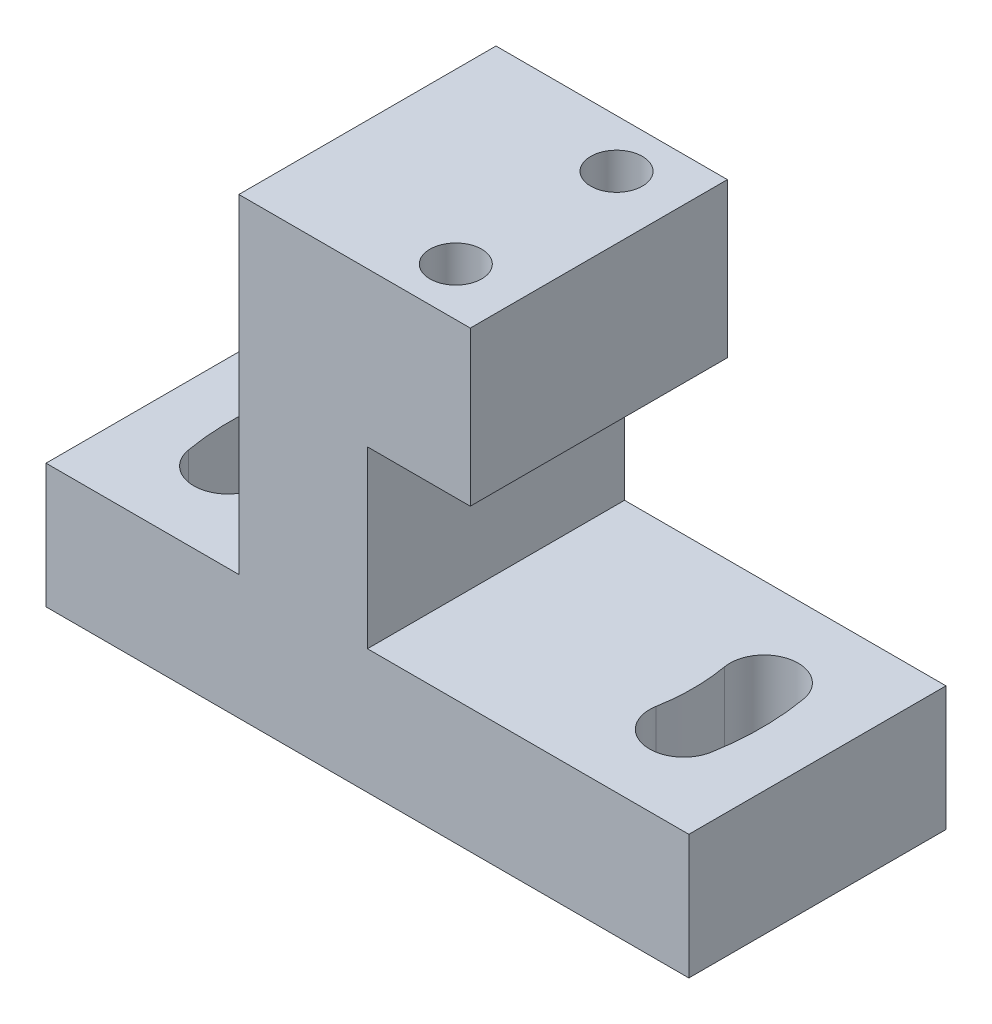
ISO-10303-21;
HEADER;
FILE_DESCRIPTION(('STEP AP214'),'2;1');
FILE_NAME('part.step','',(''),(''),'','','');
FILE_SCHEMA(('AUTOMOTIVE_DESIGN { 1 0 10303 214 1 1 1 1 }'));
ENDSEC;
DATA;
#1=APPLICATION_CONTEXT('core data for automotive mechanical design processes');
#2=APPLICATION_PROTOCOL_DEFINITION('international standard','automotive_design',2000,#1);
#3=PRODUCT_CONTEXT('',#1,'mechanical');
#4=PRODUCT('Part','Part','',(#3));
#5=PRODUCT_RELATED_PRODUCT_CATEGORY('part','',(#4));
#6=PRODUCT_DEFINITION_FORMATION('','',#4);
#7=PRODUCT_DEFINITION_CONTEXT('part definition',#1,'design');
#8=PRODUCT_DEFINITION('design','',#6,#7);
#9=PRODUCT_DEFINITION_SHAPE('','',#8);
#10=(LENGTH_UNIT() NAMED_UNIT(*) SI_UNIT(.MILLI.,.METRE.));
#11=(NAMED_UNIT(*) PLANE_ANGLE_UNIT() SI_UNIT($,.RADIAN.));
#12=(NAMED_UNIT(*) SI_UNIT($,.STERADIAN.) SOLID_ANGLE_UNIT());
#13=UNCERTAINTY_MEASURE_WITH_UNIT(LENGTH_MEASURE(1.E-05),#10,'distance_accuracy_value','');
#14=(GEOMETRIC_REPRESENTATION_CONTEXT(3) GLOBAL_UNCERTAINTY_ASSIGNED_CONTEXT((#13)) GLOBAL_UNIT_ASSIGNED_CONTEXT((#10,
#11,#12)) REPRESENTATION_CONTEXT('',''));
#15=CARTESIAN_POINT('',(0.,0.,0.));
#16=DIRECTION('',(0.,0.,1.));
#17=DIRECTION('',(1.,0.,0.));
#18=AXIS2_PLACEMENT_3D('',#15,#16,#17);
#19=CARTESIAN_POINT('',(-31.75,0.,12.7));
#20=DIRECTION('',(0.,1.,0.));
#21=DIRECTION('',(-1.,0.,0.));
#22=AXIS2_PLACEMENT_3D('',#19,#20,#21);
#23=PLANE('',#22);
#24=DIRECTION('',(1.,0.,0.));
#25=VECTOR('',#24,1.);
#26=CARTESIAN_POINT('',(-31.75,0.,-12.7));
#27=LINE('',#26,#25);
#28=CARTESIAN_POINT('',(-31.75,0.,-12.7));
#29=VERTEX_POINT('',#28);
#30=CARTESIAN_POINT('',(31.75,0.,-12.7));
#31=VERTEX_POINT('',#30);
#32=EDGE_CURVE('E253',#29,#31,#27,.T.);
#33=ORIENTED_EDGE('',*,*,#32,.T.);
#34=DIRECTION('',(0.,0.,-1.));
#35=VECTOR('',#34,1.);
#36=CARTESIAN_POINT('',(31.75,0.,12.7));
#37=LINE('',#36,#35);
#38=CARTESIAN_POINT('',(31.75,0.,12.7));
#39=VERTEX_POINT('',#38);
#40=EDGE_CURVE('E42',#39,#31,#37,.T.);
#41=ORIENTED_EDGE('',*,*,#40,.F.);
#42=DIRECTION('',(1.,0.,0.));
#43=VECTOR('',#42,1.);
#44=CARTESIAN_POINT('',(-31.75,0.,12.7));
#45=LINE('',#44,#43);
#46=CARTESIAN_POINT('',(-31.75,0.,12.7));
#47=VERTEX_POINT('',#46);
#48=EDGE_CURVE('E231',#47,#39,#45,.T.);
#49=ORIENTED_EDGE('',*,*,#48,.F.);
#50=DIRECTION('',(0.,0.,-1.));
#51=VECTOR('',#50,1.);
#52=CARTESIAN_POINT('',(-31.75,0.,12.7));
#53=LINE('',#52,#51);
#54=EDGE_CURVE('E11',#47,#29,#53,.T.);
#55=ORIENTED_EDGE('',*,*,#54,.T.);
#56=EDGE_LOOP('',(#33,#41,#49,#55));
#57=FACE_BOUND('',#56,.T.);
#58=CARTESIAN_POINT('',(22.5127052338591,0.,-3.96959734146596));
#59=DIRECTION('',(0.,1.,0.));
#60=DIRECTION('',(-1.,0.,0.));
#61=AXIS2_PLACEMENT_3D('',#58,#59,#60);
#62=CIRCLE('',#61,3.37820000000001);
#63=CARTESIAN_POINT('',(25.8395827850849,0.,-4.55621561526037));
#64=VERTEX_POINT('',#63);
#65=CARTESIAN_POINT('',(19.1858276826332,0.,-3.38297906767155));
#66=VERTEX_POINT('',#65);
#67=EDGE_CURVE('E206',#64,#66,#62,.T.);
#68=ORIENTED_EDGE('',*,*,#67,.T.);
#69=CARTESIAN_POINT('',(0.,0.,0.));
#70=DIRECTION('',(0.,-1.,0.));
#71=DIRECTION('',(-1.,0.,0.));
#72=AXIS2_PLACEMENT_3D('',#69,#70,#71);
#73=CIRCLE('',#72,19.4818);
#74=CARTESIAN_POINT('',(19.1858276826332,0.,3.38297906767154));
#75=VERTEX_POINT('',#74);
#76=EDGE_CURVE('E196',#66,#75,#73,.T.);
#77=ORIENTED_EDGE('',*,*,#76,.T.);
#78=CARTESIAN_POINT('',(22.5127052338591,0.,3.96959734146595));
#79=DIRECTION('',(0.,1.,0.));
#80=DIRECTION('',(-1.,0.,0.));
#81=AXIS2_PLACEMENT_3D('',#78,#79,#80);
#82=CIRCLE('',#81,3.37820000000001);
#83=CARTESIAN_POINT('',(25.8395827850849,0.,4.55621561526037));
#84=VERTEX_POINT('',#83);
#85=EDGE_CURVE('E199',#75,#84,#82,.T.);
#86=ORIENTED_EDGE('',*,*,#85,.T.);
#87=CARTESIAN_POINT('',(0.,0.,0.));
#88=DIRECTION('',(0.,1.,0.));
#89=DIRECTION('',(-1.,0.,0.));
#90=AXIS2_PLACEMENT_3D('',#87,#88,#89);
#91=CIRCLE('',#90,26.2382000000001);
#92=EDGE_CURVE('E203',#84,#64,#91,.T.);
#93=ORIENTED_EDGE('',*,*,#92,.T.);
#94=EDGE_LOOP('',(#68,#77,#86,#93));
#95=FACE_BOUND('',#94,.T.);
#96=CARTESIAN_POINT('',(0.,0.,0.));
#97=DIRECTION('',(0.,1.,0.));
#98=DIRECTION('',(1.,0.,0.));
#99=AXIS2_PLACEMENT_3D('',#96,#97,#98);
#100=CIRCLE('',#99,19.4818);
#101=CARTESIAN_POINT('',(-19.1858276826332,0.,-3.38297906767155));
#102=VERTEX_POINT('',#101);
#103=CARTESIAN_POINT('',(-19.1858276826332,0.,3.38297906767154));
#104=VERTEX_POINT('',#103);
#105=EDGE_CURVE('E167',#102,#104,#100,.T.);
#106=ORIENTED_EDGE('',*,*,#105,.F.);
#107=CARTESIAN_POINT('',(-22.5127052338591,0.,-3.96959734146596));
#108=DIRECTION('',(0.,-1.,0.));
#109=DIRECTION('',(1.,0.,0.));
#110=AXIS2_PLACEMENT_3D('',#107,#108,#109);
#111=CIRCLE('',#110,3.37820000000001);
#112=CARTESIAN_POINT('',(-25.8395827850849,0.,-4.55621561526037));
#113=VERTEX_POINT('',#112);
#114=EDGE_CURVE('E159',#113,#102,#111,.T.);
#115=ORIENTED_EDGE('',*,*,#114,.F.);
#116=CARTESIAN_POINT('',(0.,0.,0.));
#117=DIRECTION('',(0.,-1.,0.));
#118=DIRECTION('',(1.,0.,0.));
#119=AXIS2_PLACEMENT_3D('',#116,#117,#118);
#120=CIRCLE('',#119,26.2382000000001);
#121=CARTESIAN_POINT('',(-25.839582785085,0.,4.55621561526038));
#122=VERTEX_POINT('',#121);
#123=EDGE_CURVE('E166',#122,#113,#120,.T.);
#124=ORIENTED_EDGE('',*,*,#123,.F.);
#125=CARTESIAN_POINT('',(-22.5127052338591,0.,3.96959734146595));
#126=DIRECTION('',(0.,-1.,0.));
#127=DIRECTION('',(1.,0.,0.));
#128=AXIS2_PLACEMENT_3D('',#125,#126,#127);
#129=CIRCLE('',#128,3.37820000000001);
#130=EDGE_CURVE('E171',#104,#122,#129,.T.);
#131=ORIENTED_EDGE('',*,*,#130,.F.);
#132=EDGE_LOOP('',(#106,#115,#124,#131));
#133=FACE_BOUND('',#132,.T.);
#134=ADVANCED_FACE('F34',(#57,#95,#133),#23,.F.);
#135=CARTESIAN_POINT('',(-31.75,12.2936,12.7));
#136=DIRECTION('',(0.,-1.,0.));
#137=DIRECTION('',(0.,0.,-1.));
#138=AXIS2_PLACEMENT_3D('',#135,#136,#137);
#139=PLANE('',#138);
#140=DIRECTION('',(-1.,0.,0.));
#141=VECTOR('',#140,1.);
#142=CARTESIAN_POINT('',(-31.75,12.2936,-12.7));
#143=LINE('',#142,#141);
#144=CARTESIAN_POINT('',(-12.7,12.2936,-12.7));
#145=VERTEX_POINT('',#144);
#146=CARTESIAN_POINT('',(-31.75,12.2936,-12.7));
#147=VERTEX_POINT('',#146);
#148=EDGE_CURVE('E232',#145,#147,#143,.T.);
#149=ORIENTED_EDGE('',*,*,#148,.T.);
#150=DIRECTION('',(0.,0.,-1.));
#151=VECTOR('',#150,1.);
#152=CARTESIAN_POINT('',(-31.75,12.2936,12.7));
#153=LINE('',#152,#151);
#154=CARTESIAN_POINT('',(-31.75,12.2936,12.7));
#155=VERTEX_POINT('',#154);
#156=EDGE_CURVE('E250',#155,#147,#153,.T.);
#157=ORIENTED_EDGE('',*,*,#156,.F.);
#158=DIRECTION('',(-1.,0.,0.));
#159=VECTOR('',#158,1.);
#160=CARTESIAN_POINT('',(-31.75,12.2936,12.7));
#161=LINE('',#160,#159);
#162=CARTESIAN_POINT('',(-12.7,12.2936,12.7));
#163=VERTEX_POINT('',#162);
#164=EDGE_CURVE('E248',#163,#155,#161,.T.);
#165=ORIENTED_EDGE('',*,*,#164,.F.);
#166=DIRECTION('',(0.,0.,-1.));
#167=VECTOR('',#166,1.);
#168=CARTESIAN_POINT('',(-12.7,12.2936,12.7));
#169=LINE('',#168,#167);
#170=EDGE_CURVE('E273',#163,#145,#169,.T.);
#171=ORIENTED_EDGE('',*,*,#170,.T.);
#172=EDGE_LOOP('',(#149,#157,#165,#171));
#173=FACE_BOUND('',#172,.T.);
#174=CARTESIAN_POINT('',(0.,12.2936,0.));
#175=DIRECTION('',(0.,1.,0.));
#176=DIRECTION('',(1.,0.,0.));
#177=AXIS2_PLACEMENT_3D('',#174,#175,#176);
#178=CIRCLE('',#177,19.4818);
#179=CARTESIAN_POINT('',(-19.1858276826332,12.2936,-3.38297906767155));
#180=VERTEX_POINT('',#179);
#181=CARTESIAN_POINT('',(-19.1858276826332,12.2936,3.38297906767154));
#182=VERTEX_POINT('',#181);
#183=EDGE_CURVE('E57',#180,#182,#178,.T.);
#184=ORIENTED_EDGE('',*,*,#183,.T.);
#185=CARTESIAN_POINT('',(-22.5127052338591,12.2936,3.96959734146595));
#186=DIRECTION('',(0.,-1.,0.));
#187=DIRECTION('',(1.,0.,0.));
#188=AXIS2_PLACEMENT_3D('',#185,#186,#187);
#189=CIRCLE('',#188,3.37820000000001);
#190=CARTESIAN_POINT('',(-25.839582785085,12.2936,4.55621561526038));
#191=VERTEX_POINT('',#190);
#192=EDGE_CURVE('E174',#182,#191,#189,.T.);
#193=ORIENTED_EDGE('',*,*,#192,.T.);
#194=CARTESIAN_POINT('',(0.,12.2936,0.));
#195=DIRECTION('',(0.,-1.,0.));
#196=DIRECTION('',(1.,0.,0.));
#197=AXIS2_PLACEMENT_3D('',#194,#195,#196);
#198=CIRCLE('',#197,26.2382000000001);
#199=CARTESIAN_POINT('',(-25.8395827850849,12.2936,-4.55621561526037));
#200=VERTEX_POINT('',#199);
#201=EDGE_CURVE('E177',#191,#200,#198,.T.);
#202=ORIENTED_EDGE('',*,*,#201,.T.);
#203=CARTESIAN_POINT('',(-22.5127052338591,12.2936,-3.96959734146596));
#204=DIRECTION('',(0.,-1.,0.));
#205=DIRECTION('',(1.,0.,0.));
#206=AXIS2_PLACEMENT_3D('',#203,#204,#205);
#207=CIRCLE('',#206,3.37820000000001);
#208=EDGE_CURVE('E186',#200,#180,#207,.T.);
#209=ORIENTED_EDGE('',*,*,#208,.T.);
#210=EDGE_LOOP('',(#184,#193,#202,#209));
#211=FACE_BOUND('',#210,.T.);
#212=ADVANCED_FACE('F327',(#173,#211),#139,.F.);
#213=CARTESIAN_POINT('',(-31.75,0.,12.7));
#214=DIRECTION('',(1.,0.,0.));
#215=DIRECTION('',(0.,0.,-1.));
#216=AXIS2_PLACEMENT_3D('',#213,#214,#215);
#217=PLANE('',#216);
#218=DIRECTION('',(0.,-1.,0.));
#219=VECTOR('',#218,1.);
#220=CARTESIAN_POINT('',(-31.75,0.,-12.7));
#221=LINE('',#220,#219);
#222=EDGE_CURVE('E221',#147,#29,#221,.T.);
#223=ORIENTED_EDGE('',*,*,#222,.T.);
#224=ORIENTED_EDGE('',*,*,#54,.F.);
#225=DIRECTION('',(0.,-1.,0.));
#226=VECTOR('',#225,1.);
#227=CARTESIAN_POINT('',(-31.75,0.,12.7));
#228=LINE('',#227,#226);
#229=EDGE_CURVE('E228',#155,#47,#228,.T.);
#230=ORIENTED_EDGE('',*,*,#229,.F.);
#231=ORIENTED_EDGE('',*,*,#156,.T.);
#232=EDGE_LOOP('',(#223,#224,#230,#231));
#233=FACE_BOUND('',#232,.T.);
#234=ADVANCED_FACE('F36',(#233),#217,.F.);
#235=CARTESIAN_POINT('',(31.75,0.,12.7));
#236=DIRECTION('',(-1.,0.,0.));
#237=DIRECTION('',(0.,-1.,0.));
#238=AXIS2_PLACEMENT_3D('',#235,#236,#237);
#239=PLANE('',#238);
#240=DIRECTION('',(0.,1.,0.));
#241=VECTOR('',#240,1.);
#242=CARTESIAN_POINT('',(31.75,0.,-12.7));
#243=LINE('',#242,#241);
#244=CARTESIAN_POINT('',(31.75,12.2936,-12.7));
#245=VERTEX_POINT('',#244);
#246=EDGE_CURVE('E255',#31,#245,#243,.T.);
#247=ORIENTED_EDGE('',*,*,#246,.T.);
#248=DIRECTION('',(0.,0.,-1.));
#249=VECTOR('',#248,1.);
#250=CARTESIAN_POINT('',(31.75,12.2936,12.7));
#251=LINE('',#250,#249);
#252=CARTESIAN_POINT('',(31.75,12.2936,12.7));
#253=VERTEX_POINT('',#252);
#254=EDGE_CURVE('E291',#253,#245,#251,.T.);
#255=ORIENTED_EDGE('',*,*,#254,.F.);
#256=DIRECTION('',(0.,1.,0.));
#257=VECTOR('',#256,1.);
#258=CARTESIAN_POINT('',(31.75,0.,12.7));
#259=LINE('',#258,#257);
#260=EDGE_CURVE('E234',#39,#253,#259,.T.);
#261=ORIENTED_EDGE('',*,*,#260,.F.);
#262=ORIENTED_EDGE('',*,*,#40,.T.);
#263=EDGE_LOOP('',(#247,#255,#261,#262));
#264=FACE_BOUND('',#263,.T.);
#265=ADVANCED_FACE('F298',(#264),#239,.F.);
#266=CARTESIAN_POINT('',(12.7,12.2936,12.7));
#267=DIRECTION('',(0.,-1.,0.));
#268=DIRECTION('',(1.,0.,0.));
#269=AXIS2_PLACEMENT_3D('',#266,#267,#268);
#270=PLANE('',#269);
#271=CARTESIAN_POINT('',(22.5127052338591,12.2936,3.96959734146595));
#272=DIRECTION('',(0.,1.,0.));
#273=DIRECTION('',(-1.,0.,0.));
#274=AXIS2_PLACEMENT_3D('',#271,#272,#273);
#275=CIRCLE('',#274,3.37820000000001);
#276=CARTESIAN_POINT('',(19.1858276826332,12.2936,3.38297906767154));
#277=VERTEX_POINT('',#276);
#278=CARTESIAN_POINT('',(25.839582785085,12.2936,4.55621561526038));
#279=VERTEX_POINT('',#278);
#280=EDGE_CURVE('E211',#277,#279,#275,.T.);
#281=ORIENTED_EDGE('',*,*,#280,.F.);
#282=CARTESIAN_POINT('',(0.,12.2936,0.));
#283=DIRECTION('',(0.,-1.,0.));
#284=DIRECTION('',(-1.,0.,0.));
#285=AXIS2_PLACEMENT_3D('',#282,#283,#284);
#286=CIRCLE('',#285,19.4818);
#287=CARTESIAN_POINT('',(19.1858276826332,12.2936,-3.38297906767155));
#288=VERTEX_POINT('',#287);
#289=EDGE_CURVE('E192',#288,#277,#286,.T.);
#290=ORIENTED_EDGE('',*,*,#289,.F.);
#291=CARTESIAN_POINT('',(22.5127052338591,12.2936,-3.96959734146596));
#292=DIRECTION('',(0.,1.,0.));
#293=DIRECTION('',(-1.,0.,0.));
#294=AXIS2_PLACEMENT_3D('',#291,#292,#293);
#295=CIRCLE('',#294,3.37820000000001);
#296=CARTESIAN_POINT('',(25.8395827850849,12.2936,-4.55621561526037));
#297=VERTEX_POINT('',#296);
#298=EDGE_CURVE('E200',#297,#288,#295,.T.);
#299=ORIENTED_EDGE('',*,*,#298,.F.);
#300=CARTESIAN_POINT('',(0.,12.2936,0.));
#301=DIRECTION('',(0.,1.,0.));
#302=DIRECTION('',(-1.,0.,0.));
#303=AXIS2_PLACEMENT_3D('',#300,#301,#302);
#304=CIRCLE('',#303,26.2382000000001);
#305=EDGE_CURVE('E214',#279,#297,#304,.T.);
#306=ORIENTED_EDGE('',*,*,#305,.F.);
#307=EDGE_LOOP('',(#281,#290,#299,#306));
#308=FACE_BOUND('',#307,.T.);
#309=DIRECTION('',(-1.,0.,0.));
#310=VECTOR('',#309,1.);
#311=CARTESIAN_POINT('',(12.7,12.2936,-12.7));
#312=LINE('',#311,#310);
#313=CARTESIAN_POINT('',(0.,12.2936,-12.7));
#314=VERTEX_POINT('',#313);
#315=EDGE_CURVE('E258',#245,#314,#312,.T.);
#316=ORIENTED_EDGE('',*,*,#315,.T.);
#317=DIRECTION('',(0.,0.,-1.));
#318=VECTOR('',#317,1.);
#319=CARTESIAN_POINT('',(0.,12.2936,12.7));
#320=LINE('',#319,#318);
#321=CARTESIAN_POINT('',(0.,12.2936,12.7));
#322=VERTEX_POINT('',#321);
#323=EDGE_CURVE('E288',#322,#314,#320,.T.);
#324=ORIENTED_EDGE('',*,*,#323,.F.);
#325=DIRECTION('',(-1.,0.,0.));
#326=VECTOR('',#325,1.);
#327=CARTESIAN_POINT('',(12.7,12.2936,12.7));
#328=LINE('',#327,#326);
#329=EDGE_CURVE('E236',#253,#322,#328,.T.);
#330=ORIENTED_EDGE('',*,*,#329,.F.);
#331=ORIENTED_EDGE('',*,*,#254,.T.);
#332=EDGE_LOOP('',(#316,#324,#330,#331));
#333=FACE_BOUND('',#332,.T.);
#334=ADVANCED_FACE('F308',(#308,#333),#270,.F.);
#335=CARTESIAN_POINT('',(0.,29.5656,12.7));
#336=DIRECTION('',(-1.,0.,0.));
#337=DIRECTION('',(0.,-1.,0.));
#338=AXIS2_PLACEMENT_3D('',#335,#336,#337);
#339=PLANE('',#338);
#340=DIRECTION('',(0.,1.,0.));
#341=VECTOR('',#340,1.);
#342=CARTESIAN_POINT('',(0.,29.5656,-12.7));
#343=LINE('',#342,#341);
#344=CARTESIAN_POINT('',(0.,29.5656,-12.7));
#345=VERTEX_POINT('',#344);
#346=EDGE_CURVE('E260',#314,#345,#343,.T.);
#347=ORIENTED_EDGE('',*,*,#346,.T.);
#348=DIRECTION('',(0.,0.,-1.));
#349=VECTOR('',#348,1.);
#350=CARTESIAN_POINT('',(0.,29.5656,12.7));
#351=LINE('',#350,#349);
#352=CARTESIAN_POINT('',(0.,29.5656,12.7));
#353=VERTEX_POINT('',#352);
#354=EDGE_CURVE('E285',#353,#345,#351,.T.);
#355=ORIENTED_EDGE('',*,*,#354,.F.);
#356=DIRECTION('',(0.,1.,0.));
#357=VECTOR('',#356,1.);
#358=CARTESIAN_POINT('',(0.,29.5656,12.7));
#359=LINE('',#358,#357);
#360=EDGE_CURVE('E238',#322,#353,#359,.T.);
#361=ORIENTED_EDGE('',*,*,#360,.F.);
#362=ORIENTED_EDGE('',*,*,#323,.T.);
#363=EDGE_LOOP('',(#347,#355,#361,#362));
#364=FACE_BOUND('',#363,.T.);
#365=ADVANCED_FACE('F312',(#364),#339,.F.);
#366=CARTESIAN_POINT('',(10.16,29.5656,12.7));
#367=DIRECTION('',(0.,1.,0.));
#368=DIRECTION('',(0.,0.,1.));
#369=AXIS2_PLACEMENT_3D('',#366,#367,#368);
#370=PLANE('',#369);
#371=CARTESIAN_POINT('',(3.96875,29.5656,-7.9375));
#372=DIRECTION('',(0.,1.,0.));
#373=DIRECTION('',(0.,0.,1.));
#374=AXIS2_PLACEMENT_3D('',#371,#372,#373);
#375=CIRCLE('',#374,2.5527);
#376=CARTESIAN_POINT('',(3.96875,29.5656,-5.3848));
#377=VERTEX_POINT('',#376);
#378=EDGE_CURVE('E414',#377,#377,#375,.F.);
#379=ORIENTED_EDGE('',*,*,#378,.F.);
#380=EDGE_LOOP('',(#379));
#381=FACE_BOUND('',#380,.T.);
#382=CARTESIAN_POINT('',(3.96875,29.5656,7.9375));
#383=DIRECTION('',(0.,1.,0.));
#384=DIRECTION('',(0.,0.,1.));
#385=AXIS2_PLACEMENT_3D('',#382,#383,#384);
#386=CIRCLE('',#385,2.5527);
#387=CARTESIAN_POINT('',(3.96875,29.5656,10.4902));
#388=VERTEX_POINT('',#387);
#389=EDGE_CURVE('E180',#388,#388,#386,.F.);
#390=ORIENTED_EDGE('',*,*,#389,.F.);
#391=EDGE_LOOP('',(#390));
#392=FACE_BOUND('',#391,.T.);
#393=DIRECTION('',(1.,0.,0.));
#394=VECTOR('',#393,1.);
#395=CARTESIAN_POINT('',(10.16,29.5656,-12.7));
#396=LINE('',#395,#394);
#397=CARTESIAN_POINT('',(10.16,29.5656,-12.7));
#398=VERTEX_POINT('',#397);
#399=EDGE_CURVE('E262',#345,#398,#396,.T.);
#400=ORIENTED_EDGE('',*,*,#399,.T.);
#401=DIRECTION('',(0.,0.,-1.));
#402=VECTOR('',#401,1.);
#403=CARTESIAN_POINT('',(10.16,29.5656,12.7));
#404=LINE('',#403,#402);
#405=CARTESIAN_POINT('',(10.16,29.5656,12.7));
#406=VERTEX_POINT('',#405);
#407=EDGE_CURVE('E282',#406,#398,#404,.T.);
#408=ORIENTED_EDGE('',*,*,#407,.F.);
#409=DIRECTION('',(1.,0.,0.));
#410=VECTOR('',#409,1.);
#411=CARTESIAN_POINT('',(10.16,29.5656,12.7));
#412=LINE('',#411,#410);
#413=EDGE_CURVE('E240',#353,#406,#412,.T.);
#414=ORIENTED_EDGE('',*,*,#413,.F.);
#415=ORIENTED_EDGE('',*,*,#354,.T.);
#416=EDGE_LOOP('',(#400,#408,#414,#415));
#417=FACE_BOUND('',#416,.T.);
#418=ADVANCED_FACE('F344',(#381,#392,#417),#370,.F.);
#419=CARTESIAN_POINT('',(10.16,44.8056,12.7));
#420=DIRECTION('',(-1.,0.,0.));
#421=DIRECTION('',(0.,0.,1.));
#422=AXIS2_PLACEMENT_3D('',#419,#420,#421);
#423=PLANE('',#422);
#424=DIRECTION('',(0.,1.,0.));
#425=VECTOR('',#424,1.);
#426=CARTESIAN_POINT('',(10.16,44.8056,-12.7));
#427=LINE('',#426,#425);
#428=CARTESIAN_POINT('',(10.16,44.8056,-12.7));
#429=VERTEX_POINT('',#428);
#430=EDGE_CURVE('E264',#398,#429,#427,.T.);
#431=ORIENTED_EDGE('',*,*,#430,.T.);
#432=DIRECTION('',(0.,0.,-1.));
#433=VECTOR('',#432,1.);
#434=CARTESIAN_POINT('',(10.16,44.8056,12.7));
#435=LINE('',#434,#433);
#436=CARTESIAN_POINT('',(10.16,44.8056,12.7));
#437=VERTEX_POINT('',#436);
#438=EDGE_CURVE('E279',#437,#429,#435,.T.);
#439=ORIENTED_EDGE('',*,*,#438,.F.);
#440=DIRECTION('',(0.,1.,0.));
#441=VECTOR('',#440,1.);
#442=CARTESIAN_POINT('',(10.16,44.8056,12.7));
#443=LINE('',#442,#441);
#444=EDGE_CURVE('E242',#406,#437,#443,.T.);
#445=ORIENTED_EDGE('',*,*,#444,.F.);
#446=ORIENTED_EDGE('',*,*,#407,.T.);
#447=EDGE_LOOP('',(#431,#439,#445,#446));
#448=FACE_BOUND('',#447,.T.);
#449=ADVANCED_FACE('F341',(#448),#423,.F.);
#450=CARTESIAN_POINT('',(-12.7,44.8056,12.7));
#451=DIRECTION('',(0.,-1.,0.));
#452=DIRECTION('',(0.,0.,-1.));
#453=AXIS2_PLACEMENT_3D('',#450,#451,#452);
#454=PLANE('',#453);
#455=CARTESIAN_POINT('',(3.96875,44.8056,-7.9375));
#456=DIRECTION('',(0.,1.,0.));
#457=DIRECTION('',(0.,0.,1.));
#458=AXIS2_PLACEMENT_3D('',#455,#456,#457);
#459=CIRCLE('',#458,2.5527);
#460=CARTESIAN_POINT('',(3.96875,44.8056,-5.3848));
#461=VERTEX_POINT('',#460);
#462=EDGE_CURVE('E409',#461,#461,#459,.T.);
#463=ORIENTED_EDGE('',*,*,#462,.F.);
#464=EDGE_LOOP('',(#463));
#465=FACE_BOUND('',#464,.T.);
#466=CARTESIAN_POINT('',(3.96875,44.8056,7.9375));
#467=DIRECTION('',(0.,1.,0.));
#468=DIRECTION('',(0.,0.,1.));
#469=AXIS2_PLACEMENT_3D('',#466,#467,#468);
#470=CIRCLE('',#469,2.5527);
#471=CARTESIAN_POINT('',(3.96875,44.8056,10.4902));
#472=VERTEX_POINT('',#471);
#473=EDGE_CURVE('E412',#472,#472,#470,.T.);
#474=ORIENTED_EDGE('',*,*,#473,.F.);
#475=EDGE_LOOP('',(#474));
#476=FACE_BOUND('',#475,.T.);
#477=DIRECTION('',(-1.,0.,0.));
#478=VECTOR('',#477,1.);
#479=CARTESIAN_POINT('',(-12.7,44.8056,-12.7));
#480=LINE('',#479,#478);
#481=CARTESIAN_POINT('',(-12.7,44.8056,-12.7));
#482=VERTEX_POINT('',#481);
#483=EDGE_CURVE('E266',#429,#482,#480,.T.);
#484=ORIENTED_EDGE('',*,*,#483,.T.);
#485=DIRECTION('',(0.,0.,-1.));
#486=VECTOR('',#485,1.);
#487=CARTESIAN_POINT('',(-12.7,44.8056,12.7));
#488=LINE('',#487,#486);
#489=CARTESIAN_POINT('',(-12.7,44.8056,12.7));
#490=VERTEX_POINT('',#489);
#491=EDGE_CURVE('E276',#490,#482,#488,.T.);
#492=ORIENTED_EDGE('',*,*,#491,.F.);
#493=DIRECTION('',(-1.,0.,0.));
#494=VECTOR('',#493,1.);
#495=CARTESIAN_POINT('',(-12.7,44.8056,12.7));
#496=LINE('',#495,#494);
#497=EDGE_CURVE('E244',#437,#490,#496,.T.);
#498=ORIENTED_EDGE('',*,*,#497,.F.);
#499=ORIENTED_EDGE('',*,*,#438,.T.);
#500=EDGE_LOOP('',(#484,#492,#498,#499));
#501=FACE_BOUND('',#500,.T.);
#502=ADVANCED_FACE('F337',(#465,#476,#501),#454,.F.);
#503=CARTESIAN_POINT('',(-12.7,12.2936,12.7));
#504=DIRECTION('',(1.,0.,0.));
#505=DIRECTION('',(0.,1.,0.));
#506=AXIS2_PLACEMENT_3D('',#503,#504,#505);
#507=PLANE('',#506);
#508=DIRECTION('',(0.,-1.,0.));
#509=VECTOR('',#508,1.);
#510=CARTESIAN_POINT('',(-12.7,12.2936,-12.7));
#511=LINE('',#510,#509);
#512=EDGE_CURVE('E268',#482,#145,#511,.T.);
#513=ORIENTED_EDGE('',*,*,#512,.T.);
#514=ORIENTED_EDGE('',*,*,#170,.F.);
#515=DIRECTION('',(0.,-1.,0.));
#516=VECTOR('',#515,1.);
#517=CARTESIAN_POINT('',(-12.7,12.2936,12.7));
#518=LINE('',#517,#516);
#519=EDGE_CURVE('E246',#490,#163,#518,.T.);
#520=ORIENTED_EDGE('',*,*,#519,.F.);
#521=ORIENTED_EDGE('',*,*,#491,.T.);
#522=EDGE_LOOP('',(#513,#514,#520,#521));
#523=FACE_BOUND('',#522,.T.);
#524=ADVANCED_FACE('F333',(#523),#507,.F.);
#525=CARTESIAN_POINT('',(-31.75,12.2936,12.7));
#526=DIRECTION('',(0.,0.,-1.));
#527=DIRECTION('',(-1.,0.,0.));
#528=AXIS2_PLACEMENT_3D('',#525,#526,#527);
#529=PLANE('',#528);
#530=ORIENTED_EDGE('',*,*,#229,.T.);
#531=ORIENTED_EDGE('',*,*,#48,.T.);
#532=ORIENTED_EDGE('',*,*,#260,.T.);
#533=ORIENTED_EDGE('',*,*,#329,.T.);
#534=ORIENTED_EDGE('',*,*,#360,.T.);
#535=ORIENTED_EDGE('',*,*,#413,.T.);
#536=ORIENTED_EDGE('',*,*,#444,.T.);
#537=ORIENTED_EDGE('',*,*,#497,.T.);
#538=ORIENTED_EDGE('',*,*,#519,.T.);
#539=ORIENTED_EDGE('',*,*,#164,.T.);
#540=EDGE_LOOP('',(#530,#531,#532,#533,#534,#535,#536,#537,#538,#539));
#541=FACE_BOUND('',#540,.T.);
#542=ADVANCED_FACE('F316',(#541),#529,.F.);
#543=CARTESIAN_POINT('',(-31.75,12.2936,-12.7));
#544=DIRECTION('',(0.,0.,-1.));
#545=DIRECTION('',(-1.,0.,0.));
#546=AXIS2_PLACEMENT_3D('',#543,#544,#545);
#547=PLANE('',#546);
#548=ORIENTED_EDGE('',*,*,#222,.F.);
#549=ORIENTED_EDGE('',*,*,#148,.F.);
#550=ORIENTED_EDGE('',*,*,#512,.F.);
#551=ORIENTED_EDGE('',*,*,#483,.F.);
#552=ORIENTED_EDGE('',*,*,#430,.F.);
#553=ORIENTED_EDGE('',*,*,#399,.F.);
#554=ORIENTED_EDGE('',*,*,#346,.F.);
#555=ORIENTED_EDGE('',*,*,#315,.F.);
#556=ORIENTED_EDGE('',*,*,#246,.F.);
#557=ORIENTED_EDGE('',*,*,#32,.F.);
#558=EDGE_LOOP('',(#548,#549,#550,#551,#552,#553,#554,#555,#556,#557));
#559=FACE_BOUND('',#558,.T.);
#560=ADVANCED_FACE('F303',(#559),#547,.T.);
#561=CARTESIAN_POINT('',(0.,0.,0.));
#562=DIRECTION('',(0.,1.,0.));
#563=DIRECTION('',(-1.,0.,0.));
#564=AXIS2_PLACEMENT_3D('',#561,#562,#563);
#565=CYLINDRICAL_SURFACE('',#564,19.4818);
#566=ORIENTED_EDGE('',*,*,#289,.T.);
#567=DIRECTION('',(0.,1.,0.));
#568=VECTOR('',#567,1.);
#569=CARTESIAN_POINT('',(19.1858276826332,0.,3.38297906767154));
#570=LINE('',#569,#568);
#571=EDGE_CURVE('E209',#75,#277,#570,.T.);
#572=ORIENTED_EDGE('',*,*,#571,.F.);
#573=ORIENTED_EDGE('',*,*,#76,.F.);
#574=DIRECTION('',(0.,1.,0.));
#575=VECTOR('',#574,1.);
#576=CARTESIAN_POINT('',(19.1858276826332,0.,-3.38297906767155));
#577=LINE('',#576,#575);
#578=EDGE_CURVE('E219',#66,#288,#577,.T.);
#579=ORIENTED_EDGE('',*,*,#578,.T.);
#580=EDGE_LOOP('',(#566,#572,#573,#579));
#581=FACE_BOUND('',#580,.T.);
#582=ADVANCED_FACE('F378',(#581),#565,.T.);
#583=CARTESIAN_POINT('',(22.5127052338591,0.,-3.96959734146596));
#584=DIRECTION('',(0.,1.,0.));
#585=DIRECTION('',(-1.,0.,0.));
#586=AXIS2_PLACEMENT_3D('',#583,#584,#585);
#587=CYLINDRICAL_SURFACE('',#586,3.37820000000001);
#588=ORIENTED_EDGE('',*,*,#298,.T.);
#589=ORIENTED_EDGE('',*,*,#578,.F.);
#590=ORIENTED_EDGE('',*,*,#67,.F.);
#591=DIRECTION('',(0.,1.,0.));
#592=VECTOR('',#591,1.);
#593=CARTESIAN_POINT('',(25.8395827850849,0.,-4.55621561526037));
#594=LINE('',#593,#592);
#595=EDGE_CURVE('E222',#64,#297,#594,.T.);
#596=ORIENTED_EDGE('',*,*,#595,.T.);
#597=EDGE_LOOP('',(#588,#589,#590,#596));
#598=FACE_BOUND('',#597,.T.);
#599=ADVANCED_FACE('F381',(#598),#587,.F.);
#600=CARTESIAN_POINT('',(0.,0.,0.));
#601=DIRECTION('',(0.,1.,0.));
#602=DIRECTION('',(-1.,0.,0.));
#603=AXIS2_PLACEMENT_3D('',#600,#601,#602);
#604=CYLINDRICAL_SURFACE('',#603,26.2382000000001);
#605=ORIENTED_EDGE('',*,*,#305,.T.);
#606=ORIENTED_EDGE('',*,*,#595,.F.);
#607=ORIENTED_EDGE('',*,*,#92,.F.);
#608=DIRECTION('',(0.,1.,0.));
#609=VECTOR('',#608,1.);
#610=CARTESIAN_POINT('',(25.839582785085,0.,4.55621561526038));
#611=LINE('',#610,#609);
#612=EDGE_CURVE('E224',#84,#279,#611,.T.);
#613=ORIENTED_EDGE('',*,*,#612,.T.);
#614=EDGE_LOOP('',(#605,#606,#607,#613));
#615=FACE_BOUND('',#614,.T.);
#616=ADVANCED_FACE('F383',(#615),#604,.F.);
#617=CARTESIAN_POINT('',(22.5127052338591,0.,3.96959734146595));
#618=DIRECTION('',(0.,1.,0.));
#619=DIRECTION('',(-1.,0.,0.));
#620=AXIS2_PLACEMENT_3D('',#617,#618,#619);
#621=CYLINDRICAL_SURFACE('',#620,3.37820000000001);
#622=ORIENTED_EDGE('',*,*,#280,.T.);
#623=ORIENTED_EDGE('',*,*,#612,.F.);
#624=ORIENTED_EDGE('',*,*,#85,.F.);
#625=ORIENTED_EDGE('',*,*,#571,.T.);
#626=EDGE_LOOP('',(#622,#623,#624,#625));
#627=FACE_BOUND('',#626,.T.);
#628=ADVANCED_FACE('F374',(#627),#621,.F.);
#629=CARTESIAN_POINT('',(0.,0.,0.));
#630=DIRECTION('',(0.,1.,0.));
#631=DIRECTION('',(-1.,0.,0.));
#632=AXIS2_PLACEMENT_3D('',#629,#630,#631);
#633=CYLINDRICAL_SURFACE('',#632,19.4818);
#634=ORIENTED_EDGE('',*,*,#183,.F.);
#635=DIRECTION('',(0.,1.,0.));
#636=VECTOR('',#635,1.);
#637=CARTESIAN_POINT('',(-19.1858276826332,0.,-3.38297906767155));
#638=LINE('',#637,#636);
#639=EDGE_CURVE('E161',#102,#180,#638,.T.);
#640=ORIENTED_EDGE('',*,*,#639,.F.);
#641=ORIENTED_EDGE('',*,*,#105,.T.);
#642=DIRECTION('',(0.,1.,0.));
#643=VECTOR('',#642,1.);
#644=CARTESIAN_POINT('',(-19.1858276826332,0.,3.38297906767154));
#645=LINE('',#644,#643);
#646=EDGE_CURVE('E190',#104,#182,#645,.T.);
#647=ORIENTED_EDGE('',*,*,#646,.T.);
#648=EDGE_LOOP('',(#634,#640,#641,#647));
#649=FACE_BOUND('',#648,.T.);
#650=ADVANCED_FACE('F169',(#649),#633,.T.);
#651=CARTESIAN_POINT('',(-22.5127052338591,0.,3.96959734146595));
#652=DIRECTION('',(0.,1.,0.));
#653=DIRECTION('',(-1.,0.,0.));
#654=AXIS2_PLACEMENT_3D('',#651,#652,#653);
#655=CYLINDRICAL_SURFACE('',#654,3.37820000000001);
#656=ORIENTED_EDGE('',*,*,#192,.F.);
#657=ORIENTED_EDGE('',*,*,#646,.F.);
#658=ORIENTED_EDGE('',*,*,#130,.T.);
#659=DIRECTION('',(0.,1.,0.));
#660=VECTOR('',#659,1.);
#661=CARTESIAN_POINT('',(-25.839582785085,0.,4.55621561526038));
#662=LINE('',#661,#660);
#663=EDGE_CURVE('E193',#122,#191,#662,.T.);
#664=ORIENTED_EDGE('',*,*,#663,.T.);
#665=EDGE_LOOP('',(#656,#657,#658,#664));
#666=FACE_BOUND('',#665,.T.);
#667=ADVANCED_FACE('F431',(#666),#655,.F.);
#668=CARTESIAN_POINT('',(0.,0.,0.));
#669=DIRECTION('',(0.,1.,0.));
#670=DIRECTION('',(-1.,0.,0.));
#671=AXIS2_PLACEMENT_3D('',#668,#669,#670);
#672=CYLINDRICAL_SURFACE('',#671,26.2382000000001);
#673=ORIENTED_EDGE('',*,*,#201,.F.);
#674=ORIENTED_EDGE('',*,*,#663,.F.);
#675=ORIENTED_EDGE('',*,*,#123,.T.);
#676=DIRECTION('',(0.,1.,0.));
#677=VECTOR('',#676,1.);
#678=CARTESIAN_POINT('',(-25.8395827850849,0.,-4.55621561526037));
#679=LINE('',#678,#677);
#680=EDGE_CURVE('E49',#113,#200,#679,.T.);
#681=ORIENTED_EDGE('',*,*,#680,.T.);
#682=EDGE_LOOP('',(#673,#674,#675,#681));
#683=FACE_BOUND('',#682,.T.);
#684=ADVANCED_FACE('F434',(#683),#672,.F.);
#685=CARTESIAN_POINT('',(-22.5127052338591,0.,-3.96959734146596));
#686=DIRECTION('',(0.,1.,0.));
#687=DIRECTION('',(-1.,0.,0.));
#688=AXIS2_PLACEMENT_3D('',#685,#686,#687);
#689=CYLINDRICAL_SURFACE('',#688,3.37820000000001);
#690=ORIENTED_EDGE('',*,*,#208,.F.);
#691=ORIENTED_EDGE('',*,*,#680,.F.);
#692=ORIENTED_EDGE('',*,*,#114,.T.);
#693=ORIENTED_EDGE('',*,*,#639,.T.);
#694=EDGE_LOOP('',(#690,#691,#692,#693));
#695=FACE_BOUND('',#694,.T.);
#696=ADVANCED_FACE('F160',(#695),#689,.F.);
#697=CARTESIAN_POINT('',(3.96875,44.8056,7.9375));
#698=DIRECTION('',(0.,1.,0.));
#699=DIRECTION('',(0.,0.,1.));
#700=AXIS2_PLACEMENT_3D('',#697,#698,#699);
#701=CYLINDRICAL_SURFACE('',#700,2.5527);
#702=ORIENTED_EDGE('',*,*,#389,.T.);
#703=EDGE_LOOP('',(#702));
#704=FACE_BOUND('',#703,.T.);
#705=ORIENTED_EDGE('',*,*,#473,.T.);
#706=EDGE_LOOP('',(#705));
#707=FACE_BOUND('',#706,.T.);
#708=ADVANCED_FACE('F422',(#704,#707),#701,.F.);
#709=CARTESIAN_POINT('',(3.96875,44.8056,-7.9375));
#710=DIRECTION('',(0.,1.,0.));
#711=DIRECTION('',(0.,0.,1.));
#712=AXIS2_PLACEMENT_3D('',#709,#710,#711);
#713=CYLINDRICAL_SURFACE('',#712,2.5527);
#714=ORIENTED_EDGE('',*,*,#378,.T.);
#715=EDGE_LOOP('',(#714));
#716=FACE_BOUND('',#715,.T.);
#717=ORIENTED_EDGE('',*,*,#462,.T.);
#718=EDGE_LOOP('',(#717));
#719=FACE_BOUND('',#718,.T.);
#720=ADVANCED_FACE('F420',(#716,#719),#713,.F.);
#721=CLOSED_SHELL('',(#134,#212,#234,#265,#334,#365,#418,#449,#502,#524,#542,#560,#582,#599,
#616,#628,#650,#667,#684,#696,#708,#720));
#722=MANIFOLD_SOLID_BREP('B2',#721);
#723=ADVANCED_BREP_SHAPE_REPRESENTATION('',(#18,#722),#14);
#724=SHAPE_DEFINITION_REPRESENTATION(#9,#723);
ENDSEC;
END-ISO-10303-21;
